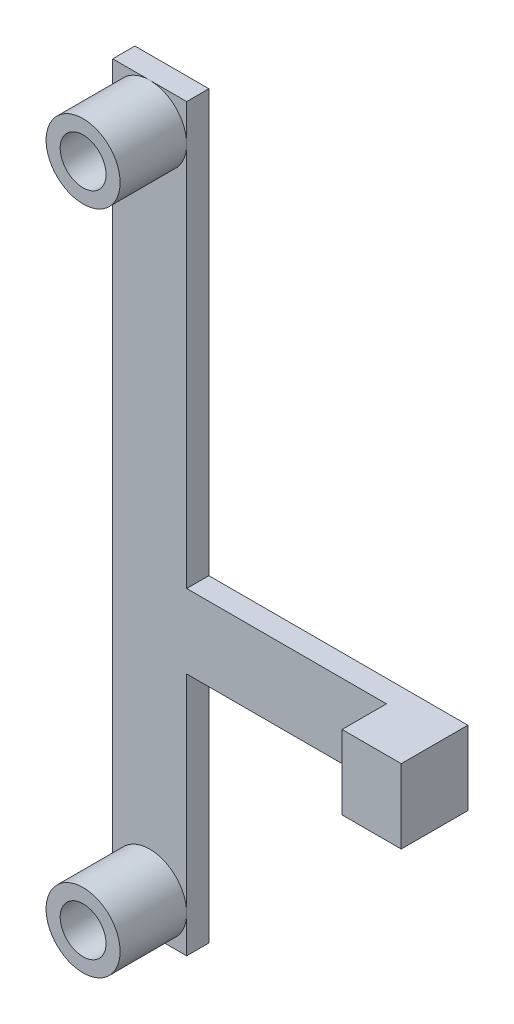
ISO-10303-21;
HEADER;
FILE_DESCRIPTION(('STEP AP214'),'2;1');
FILE_NAME('part.step','',(''),(''),'','','');
FILE_SCHEMA(('AUTOMOTIVE_DESIGN { 1 0 10303 214 1 1 1 1 }'));
ENDSEC;
DATA;
#1=APPLICATION_CONTEXT('core data for automotive mechanical design processes');
#2=APPLICATION_PROTOCOL_DEFINITION('international standard','automotive_design',2000,#1);
#3=PRODUCT_CONTEXT('',#1,'mechanical');
#4=PRODUCT('Part','Part','',(#3));
#5=PRODUCT_RELATED_PRODUCT_CATEGORY('part','',(#4));
#6=PRODUCT_DEFINITION_FORMATION('','',#4);
#7=PRODUCT_DEFINITION_CONTEXT('part definition',#1,'design');
#8=PRODUCT_DEFINITION('design','',#6,#7);
#9=PRODUCT_DEFINITION_SHAPE('','',#8);
#10=(LENGTH_UNIT() NAMED_UNIT(*) SI_UNIT(.MILLI.,.METRE.));
#11=(NAMED_UNIT(*) PLANE_ANGLE_UNIT() SI_UNIT($,.RADIAN.));
#12=(NAMED_UNIT(*) SI_UNIT($,.STERADIAN.) SOLID_ANGLE_UNIT());
#13=UNCERTAINTY_MEASURE_WITH_UNIT(LENGTH_MEASURE(1.E-05),#10,'distance_accuracy_value','');
#14=(GEOMETRIC_REPRESENTATION_CONTEXT(3) GLOBAL_UNCERTAINTY_ASSIGNED_CONTEXT((#13)) GLOBAL_UNIT_ASSIGNED_CONTEXT((#10,
#11,#12)) REPRESENTATION_CONTEXT('',''));
#15=CARTESIAN_POINT('',(0.,0.,0.));
#16=DIRECTION('',(0.,0.,1.));
#17=DIRECTION('',(1.,0.,0.));
#18=AXIS2_PLACEMENT_3D('',#15,#16,#17);
#19=CARTESIAN_POINT('',(0.,0.,0.));
#20=DIRECTION('',(0.,0.,-1.));
#21=DIRECTION('',(-1.,0.,0.));
#22=AXIS2_PLACEMENT_3D('',#19,#20,#21);
#23=PLANE('',#22);
#24=CARTESIAN_POINT('',(2.5,47.5,0.));
#25=DIRECTION('',(0.,0.,1.));
#26=DIRECTION('',(1.,0.,0.));
#27=AXIS2_PLACEMENT_3D('',#24,#25,#26);
#28=CIRCLE('',#27,2.5);
#29=CARTESIAN_POINT('',(0.,47.5,0.));
#30=VERTEX_POINT('',#29);
#31=CARTESIAN_POINT('',(5.,47.5,0.));
#32=VERTEX_POINT('',#31);
#33=EDGE_CURVE('E150',#30,#32,#28,.T.);
#34=ORIENTED_EDGE('',*,*,#33,.F.);
#35=DIRECTION('',(0.,-1.,0.));
#36=VECTOR('',#35,1.);
#37=CARTESIAN_POINT('',(0.,0.,0.));
#38=LINE('',#37,#36);
#39=CARTESIAN_POINT('',(0.,2.5,0.));
#40=VERTEX_POINT('',#39);
#41=EDGE_CURVE('E136',#30,#40,#38,.T.);
#42=ORIENTED_EDGE('',*,*,#41,.T.);
#43=CARTESIAN_POINT('',(2.5,2.5,0.));
#44=DIRECTION('',(0.,0.,1.));
#45=DIRECTION('',(1.,0.,0.));
#46=AXIS2_PLACEMENT_3D('',#43,#44,#45);
#47=CIRCLE('',#46,2.5);
#48=CARTESIAN_POINT('',(5.,2.5,0.));
#49=VERTEX_POINT('',#48);
#50=EDGE_CURVE('E39',#49,#40,#47,.T.);
#51=ORIENTED_EDGE('',*,*,#50,.F.);
#52=DIRECTION('',(0.,1.,0.));
#53=VECTOR('',#52,1.);
#54=CARTESIAN_POINT('',(5.,0.,0.));
#55=LINE('',#54,#53);
#56=CARTESIAN_POINT('',(5.,16.5,0.));
#57=VERTEX_POINT('',#56);
#58=EDGE_CURVE('E212',#49,#57,#55,.T.);
#59=ORIENTED_EDGE('',*,*,#58,.T.);
#60=DIRECTION('',(1.,0.,0.));
#61=VECTOR('',#60,1.);
#62=CARTESIAN_POINT('',(0.,16.5,0.));
#63=LINE('',#62,#61);
#64=CARTESIAN_POINT('',(18.5,16.5,0.));
#65=VERTEX_POINT('',#64);
#66=EDGE_CURVE('E210',#57,#65,#63,.T.);
#67=ORIENTED_EDGE('',*,*,#66,.T.);
#68=DIRECTION('',(0.,-1.,0.));
#69=VECTOR('',#68,1.);
#70=CARTESIAN_POINT('',(18.5,21.5,0.));
#71=LINE('',#70,#69);
#72=CARTESIAN_POINT('',(18.5,21.5,0.));
#73=VERTEX_POINT('',#72);
#74=EDGE_CURVE('E166',#73,#65,#71,.T.);
#75=ORIENTED_EDGE('',*,*,#74,.F.);
#76=DIRECTION('',(1.,0.,0.));
#77=VECTOR('',#76,1.);
#78=CARTESIAN_POINT('',(0.,21.5,0.));
#79=LINE('',#78,#77);
#80=CARTESIAN_POINT('',(5.,21.5,0.));
#81=VERTEX_POINT('',#80);
#82=EDGE_CURVE('E207',#81,#73,#79,.T.);
#83=ORIENTED_EDGE('',*,*,#82,.F.);
#84=DIRECTION('',(0.,1.,0.));
#85=VECTOR('',#84,1.);
#86=CARTESIAN_POINT('',(5.,0.,0.));
#87=LINE('',#86,#85);
#88=EDGE_CURVE('E153',#81,#32,#87,.T.);
#89=ORIENTED_EDGE('',*,*,#88,.T.);
#90=EDGE_LOOP('',(#34,#42,#51,#59,#67,#75,#83,#89));
#91=FACE_BOUND('',#90,.T.);
#92=ADVANCED_FACE('F35',(#91),#23,.F.);
#93=CARTESIAN_POINT('',(2.5,50.,0.));
#94=VERTEX_POINT('',#93);
#95=EDGE_CURVE('E50',#32,#94,#28,.T.);
#96=ORIENTED_EDGE('',*,*,#95,.F.);
#97=CARTESIAN_POINT('',(5.,50.,0.));
#98=VERTEX_POINT('',#97);
#99=EDGE_CURVE('E181',#32,#98,#87,.T.);
#100=ORIENTED_EDGE('',*,*,#99,.T.);
#101=DIRECTION('',(1.,0.,0.));
#102=VECTOR('',#101,1.);
#103=CARTESIAN_POINT('',(0.,50.,0.));
#104=LINE('',#103,#102);
#105=EDGE_CURVE('E135',#94,#98,#104,.T.);
#106=ORIENTED_EDGE('',*,*,#105,.F.);
#107=EDGE_LOOP('',(#96,#100,#106));
#108=FACE_BOUND('',#107,.T.);
#109=ADVANCED_FACE('F271',(#108),#23,.F.);
#110=EDGE_CURVE('E58',#94,#30,#28,.T.);
#111=ORIENTED_EDGE('',*,*,#110,.F.);
#112=CARTESIAN_POINT('',(0.,50.,0.));
#113=VERTEX_POINT('',#112);
#114=EDGE_CURVE('E133',#113,#94,#104,.T.);
#115=ORIENTED_EDGE('',*,*,#114,.F.);
#116=EDGE_CURVE('E129',#113,#30,#38,.T.);
#117=ORIENTED_EDGE('',*,*,#116,.T.);
#118=EDGE_LOOP('',(#111,#115,#117));
#119=FACE_BOUND('',#118,.T.);
#120=ADVANCED_FACE('F131',(#119),#23,.F.);
#121=CARTESIAN_POINT('',(2.5,2.5,4.5));
#122=DIRECTION('',(0.,0.,1.));
#123=DIRECTION('',(1.,0.,0.));
#124=AXIS2_PLACEMENT_3D('',#121,#122,#123);
#125=PLANE('',#124);
#126=CARTESIAN_POINT('',(2.5,2.5,4.5));
#127=DIRECTION('',(0.,0.,1.));
#128=DIRECTION('',(1.,0.,0.));
#129=AXIS2_PLACEMENT_3D('',#126,#127,#128);
#130=CIRCLE('',#129,2.5);
#131=CARTESIAN_POINT('',(5.,2.5,4.5));
#132=VERTEX_POINT('',#131);
#133=EDGE_CURVE('E11',#132,#132,#130,.T.);
#134=ORIENTED_EDGE('',*,*,#133,.T.);
#135=EDGE_LOOP('',(#134));
#136=FACE_BOUND('',#135,.T.);
#137=CARTESIAN_POINT('',(2.5,2.5,4.5));
#138=DIRECTION('',(0.,0.,1.));
#139=DIRECTION('',(1.,0.,0.));
#140=AXIS2_PLACEMENT_3D('',#137,#138,#139);
#141=CIRCLE('',#140,1.55);
#142=CARTESIAN_POINT('',(4.05,2.5,4.5));
#143=VERTEX_POINT('',#142);
#144=EDGE_CURVE('E237',#143,#143,#141,.T.);
#145=ORIENTED_EDGE('',*,*,#144,.F.);
#146=EDGE_LOOP('',(#145));
#147=FACE_BOUND('',#146,.T.);
#148=ADVANCED_FACE('F302',(#136,#147),#125,.T.);
#149=CARTESIAN_POINT('',(2.5,2.5,4.5));
#150=DIRECTION('',(0.,0.,-1.));
#151=DIRECTION('',(-1.,0.,0.));
#152=AXIS2_PLACEMENT_3D('',#149,#150,#151);
#153=CYLINDRICAL_SURFACE('',#152,2.5);
#154=ORIENTED_EDGE('',*,*,#133,.F.);
#155=EDGE_LOOP('',(#154));
#156=FACE_BOUND('',#155,.T.);
#157=ORIENTED_EDGE('',*,*,#50,.T.);
#158=CARTESIAN_POINT('',(2.5,0.,0.));
#159=VERTEX_POINT('',#158);
#160=EDGE_CURVE('E243',#40,#159,#47,.T.);
#161=ORIENTED_EDGE('',*,*,#160,.T.);
#162=EDGE_CURVE('E239',#159,#49,#47,.T.);
#163=ORIENTED_EDGE('',*,*,#162,.T.);
#164=EDGE_LOOP('',(#157,#161,#163));
#165=FACE_BOUND('',#164,.T.);
#166=ADVANCED_FACE('F37',(#156,#165),#153,.T.);
#167=CARTESIAN_POINT('',(2.5,2.5,4.5));
#168=DIRECTION('',(0.,0.,-1.));
#169=DIRECTION('',(-1.,0.,0.));
#170=AXIS2_PLACEMENT_3D('',#167,#168,#169);
#171=CYLINDRICAL_SURFACE('',#170,1.55);
#172=ORIENTED_EDGE('',*,*,#144,.T.);
#173=EDGE_LOOP('',(#172));
#174=FACE_BOUND('',#173,.T.);
#175=CARTESIAN_POINT('',(2.5,2.5,-1.5));
#176=DIRECTION('',(0.,0.,-1.));
#177=DIRECTION('',(-1.,0.,0.));
#178=AXIS2_PLACEMENT_3D('',#175,#176,#177);
#179=CIRCLE('',#178,1.55);
#180=CARTESIAN_POINT('',(0.95,2.5,-1.5));
#181=VERTEX_POINT('',#180);
#182=EDGE_CURVE('E202',#181,#181,#179,.F.);
#183=ORIENTED_EDGE('',*,*,#182,.F.);
#184=EDGE_LOOP('',(#183));
#185=FACE_BOUND('',#184,.T.);
#186=ADVANCED_FACE('F288',(#174,#185),#171,.F.);
#187=ORIENTED_EDGE('',*,*,#160,.F.);
#188=CARTESIAN_POINT('',(0.,0.,0.));
#189=VERTEX_POINT('',#188);
#190=EDGE_CURVE('E138',#40,#189,#38,.T.);
#191=ORIENTED_EDGE('',*,*,#190,.T.);
#192=DIRECTION('',(-1.,0.,0.));
#193=VECTOR('',#192,1.);
#194=CARTESIAN_POINT('',(0.,0.,0.));
#195=LINE('',#194,#193);
#196=EDGE_CURVE('E215',#159,#189,#195,.T.);
#197=ORIENTED_EDGE('',*,*,#196,.F.);
#198=EDGE_LOOP('',(#187,#191,#197));
#199=FACE_BOUND('',#198,.T.);
#200=ADVANCED_FACE('F286',(#199),#23,.F.);
#201=CARTESIAN_POINT('',(5.,0.,-1.5));
#202=DIRECTION('',(1.,0.,0.));
#203=DIRECTION('',(0.,0.,-1.));
#204=AXIS2_PLACEMENT_3D('',#201,#202,#203);
#205=PLANE('',#204);
#206=ORIENTED_EDGE('',*,*,#88,.F.);
#207=DIRECTION('',(0.,0.,1.));
#208=VECTOR('',#207,1.);
#209=CARTESIAN_POINT('',(5.,21.5,-1.5));
#210=LINE('',#209,#208);
#211=CARTESIAN_POINT('',(5.,21.5,-1.5));
#212=VERTEX_POINT('',#211);
#213=EDGE_CURVE('E235',#212,#81,#210,.T.);
#214=ORIENTED_EDGE('',*,*,#213,.F.);
#215=DIRECTION('',(0.,1.,0.));
#216=VECTOR('',#215,1.);
#217=CARTESIAN_POINT('',(5.,0.,-1.5));
#218=LINE('',#217,#216);
#219=CARTESIAN_POINT('',(5.,50.,-1.5));
#220=VERTEX_POINT('',#219);
#221=EDGE_CURVE('E182',#212,#220,#218,.T.);
#222=ORIENTED_EDGE('',*,*,#221,.T.);
#223=DIRECTION('',(0.,0.,1.));
#224=VECTOR('',#223,1.);
#225=CARTESIAN_POINT('',(5.,50.,-1.5));
#226=LINE('',#225,#224);
#227=EDGE_CURVE('E205',#220,#98,#226,.T.);
#228=ORIENTED_EDGE('',*,*,#227,.T.);
#229=ORIENTED_EDGE('',*,*,#99,.F.);
#230=EDGE_LOOP('',(#206,#214,#222,#228,#229));
#231=FACE_BOUND('',#230,.T.);
#232=ADVANCED_FACE('F268',(#231),#205,.T.);
#233=CARTESIAN_POINT('',(0.,21.5,-1.5));
#234=DIRECTION('',(0.,-1.,0.));
#235=DIRECTION('',(1.,0.,0.));
#236=AXIS2_PLACEMENT_3D('',#233,#234,#235);
#237=PLANE('',#236);
#238=ORIENTED_EDGE('',*,*,#82,.T.);
#239=DIRECTION('',(0.,0.,-1.));
#240=VECTOR('',#239,1.);
#241=CARTESIAN_POINT('',(18.5,21.5,3.));
#242=LINE('',#241,#240);
#243=CARTESIAN_POINT('',(18.5,21.5,3.));
#244=VERTEX_POINT('',#243);
#245=EDGE_CURVE('E178',#244,#73,#242,.T.);
#246=ORIENTED_EDGE('',*,*,#245,.F.);
#247=DIRECTION('',(-1.,0.,0.));
#248=VECTOR('',#247,1.);
#249=CARTESIAN_POINT('',(22.5,21.5,3.));
#250=LINE('',#249,#248);
#251=CARTESIAN_POINT('',(22.5,21.5,3.));
#252=VERTEX_POINT('',#251);
#253=EDGE_CURVE('E165',#252,#244,#250,.T.);
#254=ORIENTED_EDGE('',*,*,#253,.F.);
#255=DIRECTION('',(0.,0.,1.));
#256=VECTOR('',#255,1.);
#257=CARTESIAN_POINT('',(22.5,21.5,-1.5));
#258=LINE('',#257,#256);
#259=CARTESIAN_POINT('',(22.5,21.5,-1.5));
#260=VERTEX_POINT('',#259);
#261=EDGE_CURVE('E233',#260,#252,#258,.T.);
#262=ORIENTED_EDGE('',*,*,#261,.F.);
#263=DIRECTION('',(1.,0.,0.));
#264=VECTOR('',#263,1.);
#265=CARTESIAN_POINT('',(0.,21.5,-1.5));
#266=LINE('',#265,#264);
#267=EDGE_CURVE('E185',#212,#260,#266,.T.);
#268=ORIENTED_EDGE('',*,*,#267,.F.);
#269=ORIENTED_EDGE('',*,*,#213,.T.);
#270=EDGE_LOOP('',(#238,#246,#254,#262,#268,#269));
#271=FACE_BOUND('',#270,.T.);
#272=ADVANCED_FACE('F262',(#271),#237,.F.);
#273=CARTESIAN_POINT('',(22.5,0.,-1.5));
#274=DIRECTION('',(-1.,0.,0.));
#275=DIRECTION('',(0.,-1.,0.));
#276=AXIS2_PLACEMENT_3D('',#273,#274,#275);
#277=PLANE('',#276);
#278=ORIENTED_EDGE('',*,*,#261,.T.);
#279=DIRECTION('',(0.,1.,0.));
#280=VECTOR('',#279,1.);
#281=CARTESIAN_POINT('',(22.5,16.5,3.));
#282=LINE('',#281,#280);
#283=CARTESIAN_POINT('',(22.5,16.5,3.));
#284=VERTEX_POINT('',#283);
#285=EDGE_CURVE('E162',#284,#252,#282,.T.);
#286=ORIENTED_EDGE('',*,*,#285,.F.);
#287=DIRECTION('',(0.,0.,1.));
#288=VECTOR('',#287,1.);
#289=CARTESIAN_POINT('',(22.5,16.5,-1.5));
#290=LINE('',#289,#288);
#291=CARTESIAN_POINT('',(22.5,16.5,-1.5));
#292=VERTEX_POINT('',#291);
#293=EDGE_CURVE('E231',#292,#284,#290,.T.);
#294=ORIENTED_EDGE('',*,*,#293,.F.);
#295=DIRECTION('',(0.,-1.,0.));
#296=VECTOR('',#295,1.);
#297=CARTESIAN_POINT('',(22.5,0.,-1.5));
#298=LINE('',#297,#296);
#299=EDGE_CURVE('E187',#260,#292,#298,.T.);
#300=ORIENTED_EDGE('',*,*,#299,.F.);
#301=EDGE_LOOP('',(#278,#286,#294,#300));
#302=FACE_BOUND('',#301,.T.);
#303=ADVANCED_FACE('F377',(#302),#277,.F.);
#304=CARTESIAN_POINT('',(0.,16.5,-1.5));
#305=DIRECTION('',(0.,-1.,0.));
#306=DIRECTION('',(0.,0.,-1.));
#307=AXIS2_PLACEMENT_3D('',#304,#305,#306);
#308=PLANE('',#307);
#309=ORIENTED_EDGE('',*,*,#66,.F.);
#310=DIRECTION('',(0.,0.,1.));
#311=VECTOR('',#310,1.);
#312=CARTESIAN_POINT('',(5.,16.5,-1.5));
#313=LINE('',#312,#311);
#314=CARTESIAN_POINT('',(5.,16.5,-1.5));
#315=VERTEX_POINT('',#314);
#316=EDGE_CURVE('E228',#315,#57,#313,.T.);
#317=ORIENTED_EDGE('',*,*,#316,.F.);
#318=DIRECTION('',(1.,0.,0.));
#319=VECTOR('',#318,1.);
#320=CARTESIAN_POINT('',(0.,16.5,-1.5));
#321=LINE('',#320,#319);
#322=EDGE_CURVE('E189',#315,#292,#321,.T.);
#323=ORIENTED_EDGE('',*,*,#322,.T.);
#324=ORIENTED_EDGE('',*,*,#293,.T.);
#325=DIRECTION('',(1.,0.,0.));
#326=VECTOR('',#325,1.);
#327=CARTESIAN_POINT('',(22.5,16.5,3.));
#328=LINE('',#327,#326);
#329=CARTESIAN_POINT('',(18.5,16.5,3.));
#330=VERTEX_POINT('',#329);
#331=EDGE_CURVE('E170',#330,#284,#328,.T.);
#332=ORIENTED_EDGE('',*,*,#331,.F.);
#333=DIRECTION('',(0.,0.,-1.));
#334=VECTOR('',#333,1.);
#335=CARTESIAN_POINT('',(18.5,16.5,3.));
#336=LINE('',#335,#334);
#337=EDGE_CURVE('E173',#330,#65,#336,.T.);
#338=ORIENTED_EDGE('',*,*,#337,.T.);
#339=EDGE_LOOP('',(#309,#317,#323,#324,#332,#338));
#340=FACE_BOUND('',#339,.T.);
#341=ADVANCED_FACE('F254',(#340),#308,.T.);
#342=CARTESIAN_POINT('',(5.,0.,-1.5));
#343=DIRECTION('',(1.,0.,0.));
#344=DIRECTION('',(0.,1.,0.));
#345=AXIS2_PLACEMENT_3D('',#342,#343,#344);
#346=PLANE('',#345);
#347=CARTESIAN_POINT('',(5.,0.,0.));
#348=VERTEX_POINT('',#347);
#349=EDGE_CURVE('E213',#348,#49,#55,.T.);
#350=ORIENTED_EDGE('',*,*,#349,.F.);
#351=DIRECTION('',(0.,0.,1.));
#352=VECTOR('',#351,1.);
#353=CARTESIAN_POINT('',(5.,0.,-1.5));
#354=LINE('',#353,#352);
#355=CARTESIAN_POINT('',(5.,0.,-1.5));
#356=VERTEX_POINT('',#355);
#357=EDGE_CURVE('E226',#356,#348,#354,.T.);
#358=ORIENTED_EDGE('',*,*,#357,.F.);
#359=DIRECTION('',(0.,1.,0.));
#360=VECTOR('',#359,1.);
#361=CARTESIAN_POINT('',(5.,0.,-1.5));
#362=LINE('',#361,#360);
#363=EDGE_CURVE('E192',#356,#315,#362,.T.);
#364=ORIENTED_EDGE('',*,*,#363,.T.);
#365=ORIENTED_EDGE('',*,*,#316,.T.);
#366=ORIENTED_EDGE('',*,*,#58,.F.);
#367=EDGE_LOOP('',(#350,#358,#364,#365,#366));
#368=FACE_BOUND('',#367,.T.);
#369=ADVANCED_FACE('F250',(#368),#346,.T.);
#370=CARTESIAN_POINT('',(0.,0.,-1.5));
#371=DIRECTION('',(0.,1.,0.));
#372=DIRECTION('',(0.,0.,1.));
#373=AXIS2_PLACEMENT_3D('',#370,#371,#372);
#374=PLANE('',#373);
#375=EDGE_CURVE('E216',#348,#159,#195,.T.);
#376=ORIENTED_EDGE('',*,*,#375,.T.);
#377=ORIENTED_EDGE('',*,*,#196,.T.);
#378=DIRECTION('',(0.,0.,1.));
#379=VECTOR('',#378,1.);
#380=CARTESIAN_POINT('',(0.,0.,-1.5));
#381=LINE('',#380,#379);
#382=CARTESIAN_POINT('',(0.,0.,-1.5));
#383=VERTEX_POINT('',#382);
#384=EDGE_CURVE('E224',#383,#189,#381,.T.);
#385=ORIENTED_EDGE('',*,*,#384,.F.);
#386=DIRECTION('',(-1.,0.,0.));
#387=VECTOR('',#386,1.);
#388=CARTESIAN_POINT('',(0.,0.,-1.5));
#389=LINE('',#388,#387);
#390=EDGE_CURVE('E195',#356,#383,#389,.T.);
#391=ORIENTED_EDGE('',*,*,#390,.F.);
#392=ORIENTED_EDGE('',*,*,#357,.T.);
#393=EDGE_LOOP('',(#376,#377,#385,#391,#392));
#394=FACE_BOUND('',#393,.T.);
#395=ADVANCED_FACE('F282',(#394),#374,.F.);
#396=CARTESIAN_POINT('',(0.,0.,-1.5));
#397=DIRECTION('',(-1.,0.,0.));
#398=DIRECTION('',(0.,0.,1.));
#399=AXIS2_PLACEMENT_3D('',#396,#397,#398);
#400=PLANE('',#399);
#401=ORIENTED_EDGE('',*,*,#116,.F.);
#402=DIRECTION('',(0.,0.,1.));
#403=VECTOR('',#402,1.);
#404=CARTESIAN_POINT('',(0.,50.,-1.5));
#405=LINE('',#404,#403);
#406=CARTESIAN_POINT('',(0.,50.,-1.5));
#407=VERTEX_POINT('',#406);
#408=EDGE_CURVE('E222',#407,#113,#405,.T.);
#409=ORIENTED_EDGE('',*,*,#408,.F.);
#410=DIRECTION('',(0.,-1.,0.));
#411=VECTOR('',#410,1.);
#412=CARTESIAN_POINT('',(0.,0.,-1.5));
#413=LINE('',#412,#411);
#414=EDGE_CURVE('E197',#407,#383,#413,.T.);
#415=ORIENTED_EDGE('',*,*,#414,.T.);
#416=ORIENTED_EDGE('',*,*,#384,.T.);
#417=ORIENTED_EDGE('',*,*,#190,.F.);
#418=ORIENTED_EDGE('',*,*,#41,.F.);
#419=EDGE_LOOP('',(#401,#409,#415,#416,#417,#418));
#420=FACE_BOUND('',#419,.T.);
#421=ADVANCED_FACE('F141',(#420),#400,.T.);
#422=CARTESIAN_POINT('',(0.,50.,-1.5));
#423=DIRECTION('',(0.,-1.,0.));
#424=DIRECTION('',(0.,0.,-1.));
#425=AXIS2_PLACEMENT_3D('',#422,#423,#424);
#426=PLANE('',#425);
#427=ORIENTED_EDGE('',*,*,#114,.T.);
#428=ORIENTED_EDGE('',*,*,#105,.T.);
#429=ORIENTED_EDGE('',*,*,#227,.F.);
#430=DIRECTION('',(1.,0.,0.));
#431=VECTOR('',#430,1.);
#432=CARTESIAN_POINT('',(0.,50.,-1.5));
#433=LINE('',#432,#431);
#434=EDGE_CURVE('E200',#407,#220,#433,.T.);
#435=ORIENTED_EDGE('',*,*,#434,.F.);
#436=ORIENTED_EDGE('',*,*,#408,.T.);
#437=EDGE_LOOP('',(#427,#428,#429,#435,#436));
#438=FACE_BOUND('',#437,.T.);
#439=ADVANCED_FACE('F273',(#438),#426,.F.);
#440=CARTESIAN_POINT('',(0.,0.,-1.5));
#441=DIRECTION('',(0.,0.,-1.));
#442=DIRECTION('',(-1.,0.,0.));
#443=AXIS2_PLACEMENT_3D('',#440,#441,#442);
#444=PLANE('',#443);
#445=CARTESIAN_POINT('',(2.5,47.5,-1.5));
#446=DIRECTION('',(0.,0.,-1.));
#447=DIRECTION('',(-1.,0.,0.));
#448=AXIS2_PLACEMENT_3D('',#445,#446,#447);
#449=CIRCLE('',#448,1.55);
#450=CARTESIAN_POINT('',(0.949999999999998,47.5,-1.5));
#451=VERTEX_POINT('',#450);
#452=EDGE_CURVE('E155',#451,#451,#449,.T.);
#453=ORIENTED_EDGE('',*,*,#452,.F.);
#454=EDGE_LOOP('',(#453));
#455=FACE_BOUND('',#454,.T.);
#456=ORIENTED_EDGE('',*,*,#221,.F.);
#457=ORIENTED_EDGE('',*,*,#267,.T.);
#458=ORIENTED_EDGE('',*,*,#299,.T.);
#459=ORIENTED_EDGE('',*,*,#322,.F.);
#460=ORIENTED_EDGE('',*,*,#363,.F.);
#461=ORIENTED_EDGE('',*,*,#390,.T.);
#462=ORIENTED_EDGE('',*,*,#414,.F.);
#463=ORIENTED_EDGE('',*,*,#434,.T.);
#464=EDGE_LOOP('',(#456,#457,#458,#459,#460,#461,#462,#463));
#465=FACE_BOUND('',#464,.T.);
#466=ORIENTED_EDGE('',*,*,#182,.T.);
#467=EDGE_LOOP('',(#466));
#468=FACE_BOUND('',#467,.T.);
#469=ADVANCED_FACE('F278',(#455,#465,#468),#444,.T.);
#470=ORIENTED_EDGE('',*,*,#162,.F.);
#471=ORIENTED_EDGE('',*,*,#375,.F.);
#472=ORIENTED_EDGE('',*,*,#349,.T.);
#473=EDGE_LOOP('',(#470,#471,#472));
#474=FACE_BOUND('',#473,.T.);
#475=ADVANCED_FACE('F290',(#474),#23,.F.);
#476=CARTESIAN_POINT('',(18.5,21.5,3.));
#477=DIRECTION('',(1.,0.,0.));
#478=DIRECTION('',(0.,0.,-1.));
#479=AXIS2_PLACEMENT_3D('',#476,#477,#478);
#480=PLANE('',#479);
#481=ORIENTED_EDGE('',*,*,#74,.T.);
#482=ORIENTED_EDGE('',*,*,#337,.F.);
#483=DIRECTION('',(0.,-1.,0.));
#484=VECTOR('',#483,1.);
#485=CARTESIAN_POINT('',(18.5,21.5,3.));
#486=LINE('',#485,#484);
#487=EDGE_CURVE('E168',#244,#330,#486,.T.);
#488=ORIENTED_EDGE('',*,*,#487,.F.);
#489=ORIENTED_EDGE('',*,*,#245,.T.);
#490=EDGE_LOOP('',(#481,#482,#488,#489));
#491=FACE_BOUND('',#490,.T.);
#492=ADVANCED_FACE('F259',(#491),#480,.F.);
#493=CARTESIAN_POINT('',(0.,0.,3.));
#494=DIRECTION('',(0.,0.,1.));
#495=DIRECTION('',(1.,0.,0.));
#496=AXIS2_PLACEMENT_3D('',#493,#494,#495);
#497=PLANE('',#496);
#498=ORIENTED_EDGE('',*,*,#285,.T.);
#499=ORIENTED_EDGE('',*,*,#253,.T.);
#500=ORIENTED_EDGE('',*,*,#487,.T.);
#501=ORIENTED_EDGE('',*,*,#331,.T.);
#502=EDGE_LOOP('',(#498,#499,#500,#501));
#503=FACE_BOUND('',#502,.T.);
#504=ADVANCED_FACE('F404',(#503),#497,.T.);
#505=CARTESIAN_POINT('',(2.5,47.5,4.5));
#506=DIRECTION('',(0.,0.,-1.));
#507=DIRECTION('',(-1.,0.,0.));
#508=AXIS2_PLACEMENT_3D('',#505,#506,#507);
#509=CYLINDRICAL_SURFACE('',#508,2.5);
#510=CARTESIAN_POINT('',(2.5,47.5,4.5));
#511=DIRECTION('',(0.,0.,1.));
#512=DIRECTION('',(1.,0.,0.));
#513=AXIS2_PLACEMENT_3D('',#510,#511,#512);
#514=CIRCLE('',#513,2.5);
#515=CARTESIAN_POINT('',(5.,47.5,4.5));
#516=VERTEX_POINT('',#515);
#517=EDGE_CURVE('E158',#516,#516,#514,.T.);
#518=ORIENTED_EDGE('',*,*,#517,.F.);
#519=EDGE_LOOP('',(#518));
#520=FACE_BOUND('',#519,.T.);
#521=ORIENTED_EDGE('',*,*,#95,.T.);
#522=ORIENTED_EDGE('',*,*,#110,.T.);
#523=ORIENTED_EDGE('',*,*,#33,.T.);
#524=EDGE_LOOP('',(#521,#522,#523));
#525=FACE_BOUND('',#524,.T.);
#526=ADVANCED_FACE('F157',(#520,#525),#509,.T.);
#527=CARTESIAN_POINT('',(2.5,47.5,4.5));
#528=DIRECTION('',(0.,0.,1.));
#529=DIRECTION('',(1.,0.,0.));
#530=AXIS2_PLACEMENT_3D('',#527,#528,#529);
#531=PLANE('',#530);
#532=CARTESIAN_POINT('',(2.5,47.5,4.5));
#533=DIRECTION('',(0.,0.,1.));
#534=DIRECTION('',(1.,0.,0.));
#535=AXIS2_PLACEMENT_3D('',#532,#533,#534);
#536=CIRCLE('',#535,1.55);
#537=CARTESIAN_POINT('',(4.05,47.5,4.5));
#538=VERTEX_POINT('',#537);
#539=EDGE_CURVE('E463',#538,#538,#536,.T.);
#540=ORIENTED_EDGE('',*,*,#539,.F.);
#541=EDGE_LOOP('',(#540));
#542=FACE_BOUND('',#541,.T.);
#543=ORIENTED_EDGE('',*,*,#517,.T.);
#544=EDGE_LOOP('',(#543));
#545=FACE_BOUND('',#544,.T.);
#546=ADVANCED_FACE('F432',(#542,#545),#531,.T.);
#547=CARTESIAN_POINT('',(2.5,47.5,-6.));
#548=DIRECTION('',(0.,0.,1.));
#549=DIRECTION('',(1.,0.,0.));
#550=AXIS2_PLACEMENT_3D('',#547,#548,#549);
#551=CYLINDRICAL_SURFACE('',#550,1.55);
#552=ORIENTED_EDGE('',*,*,#452,.T.);
#553=EDGE_LOOP('',(#552));
#554=FACE_BOUND('',#553,.T.);
#555=ORIENTED_EDGE('',*,*,#539,.T.);
#556=EDGE_LOOP('',(#555));
#557=FACE_BOUND('',#556,.T.);
#558=ADVANCED_FACE('F443',(#554,#557),#551,.F.);
#559=CLOSED_SHELL('',(#92,#109,#120,#148,#166,#186,#200,#232,#272,#303,#341,#369,#395,#421,#439,
#469,#475,#492,#504,#526,#546,#558));
#560=MANIFOLD_SOLID_BREP('B2',#559);
#561=ADVANCED_BREP_SHAPE_REPRESENTATION('',(#18,#560),#14);
#562=SHAPE_DEFINITION_REPRESENTATION(#9,#561);
ENDSEC;
END-ISO-10303-21;
